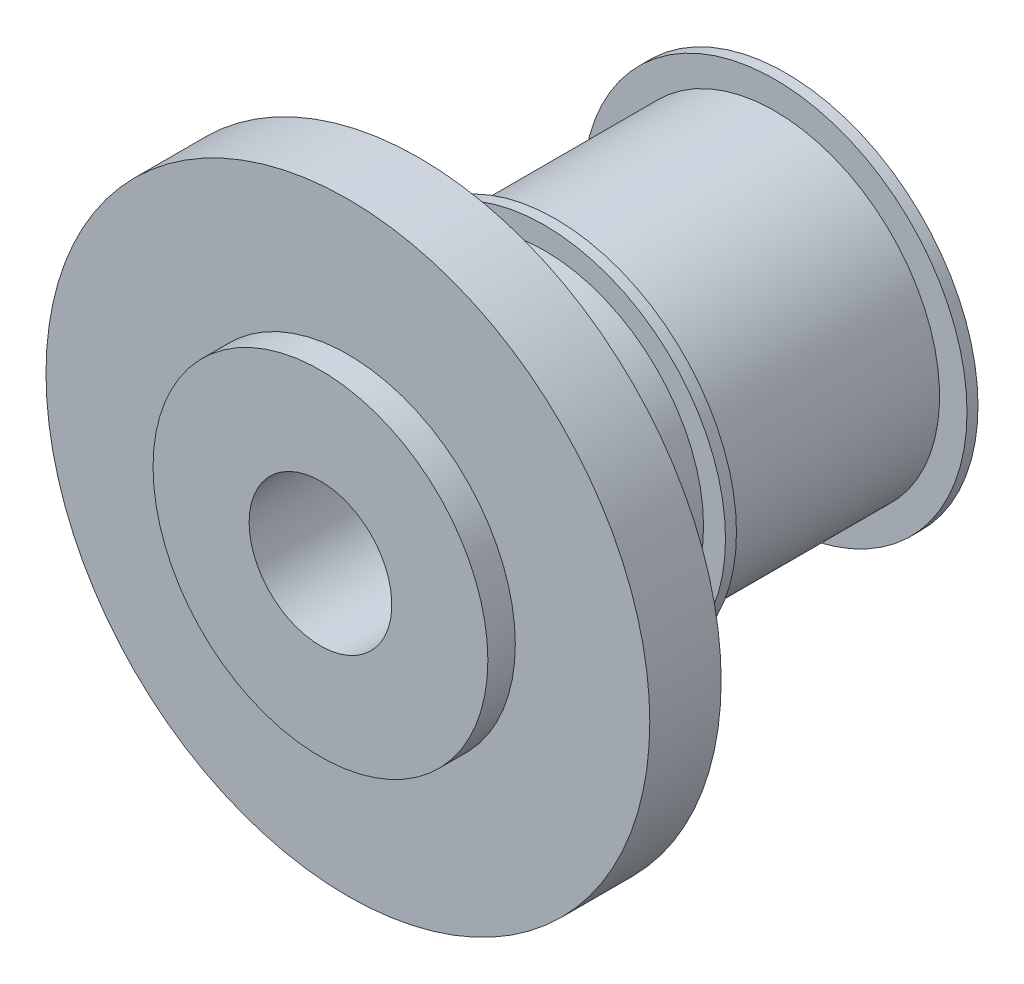
ISO-10303-21;
HEADER;
FILE_DESCRIPTION(('STEP AP214'),'2;1');
FILE_NAME('part.step','',(''),(''),'','','');
FILE_SCHEMA(('AUTOMOTIVE_DESIGN { 1 0 10303 214 1 1 1 1 }'));
ENDSEC;
DATA;
#1=APPLICATION_CONTEXT('core data for automotive mechanical design processes');
#2=APPLICATION_PROTOCOL_DEFINITION('international standard','automotive_design',2000,#1);
#3=PRODUCT_CONTEXT('',#1,'mechanical');
#4=PRODUCT('Part','Part','',(#3));
#5=PRODUCT_RELATED_PRODUCT_CATEGORY('part','',(#4));
#6=PRODUCT_DEFINITION_FORMATION('','',#4);
#7=PRODUCT_DEFINITION_CONTEXT('part definition',#1,'design');
#8=PRODUCT_DEFINITION('design','',#6,#7);
#9=PRODUCT_DEFINITION_SHAPE('','',#8);
#10=(LENGTH_UNIT() NAMED_UNIT(*) SI_UNIT(.MILLI.,.METRE.));
#11=(NAMED_UNIT(*) PLANE_ANGLE_UNIT() SI_UNIT($,.RADIAN.));
#12=(NAMED_UNIT(*) SI_UNIT($,.STERADIAN.) SOLID_ANGLE_UNIT());
#13=UNCERTAINTY_MEASURE_WITH_UNIT(LENGTH_MEASURE(1.E-05),#10,'distance_accuracy_value','');
#14=(GEOMETRIC_REPRESENTATION_CONTEXT(3) GLOBAL_UNCERTAINTY_ASSIGNED_CONTEXT((#13)) GLOBAL_UNIT_ASSIGNED_CONTEXT((#10,
#11,#12)) REPRESENTATION_CONTEXT('',''));
#15=CARTESIAN_POINT('',(0.,0.,0.));
#16=DIRECTION('',(0.,0.,1.));
#17=DIRECTION('',(1.,0.,0.));
#18=AXIS2_PLACEMENT_3D('',#15,#16,#17);
#19=CARTESIAN_POINT('',(22.3271333719099,24.3001875587976,30.6307629176066));
#20=DIRECTION('',(0.,0.,-1.));
#21=DIRECTION('',(-1.,0.,0.));
#22=AXIS2_PLACEMENT_3D('',#19,#20,#21);
#23=PLANE('',#22);
#24=CARTESIAN_POINT('',(-3.58874033552007E-12,-9.37916467798973E-13,30.6307629176066));
#25=DIRECTION('',(0.,0.,-1.));
#26=DIRECTION('',(-1.,0.,0.));
#27=AXIS2_PLACEMENT_3D('',#24,#25,#26);
#28=CIRCLE('',#27,29.);
#29=CARTESIAN_POINT('',(-29.0000000000036,-9.37916467798973E-13,30.6307629176066));
#30=VERTEX_POINT('',#29);
#31=EDGE_CURVE('E18',#30,#30,#28,.F.);
#32=ORIENTED_EDGE('',*,*,#31,.F.);
#33=EDGE_LOOP('',(#32));
#34=FACE_BOUND('',#33,.T.);
#35=CARTESIAN_POINT('',(-3.58874033552007E-12,-9.37916467798973E-13,30.6307629176066));
#36=DIRECTION('',(0.,0.,-1.));
#37=DIRECTION('',(-1.,0.,0.));
#38=AXIS2_PLACEMENT_3D('',#35,#36,#37);
#39=CIRCLE('',#38,33.);
#40=CARTESIAN_POINT('',(-33.0000000000036,-9.37916467798973E-13,30.6307629176066));
#41=VERTEX_POINT('',#40);
#42=EDGE_CURVE('E88',#41,#41,#39,.T.);
#43=ORIENTED_EDGE('',*,*,#42,.F.);
#44=EDGE_LOOP('',(#43));
#45=FACE_BOUND('',#44,.T.);
#46=ADVANCED_FACE('F15',(#34,#45),#23,.F.);
#47=CARTESIAN_POINT('',(-3.61666252501891E-12,-9.37916411203332E-13,-472.369237082393));
#48=DIRECTION('',(0.,0.,-1.));
#49=DIRECTION('',(-1.,0.,0.));
#50=AXIS2_PLACEMENT_3D('',#47,#48,#49);
#51=CYLINDRICAL_SURFACE('',#50,29.);
#52=ORIENTED_EDGE('',*,*,#31,.T.);
#53=EDGE_LOOP('',(#52));
#54=FACE_BOUND('',#53,.T.);
#55=CARTESIAN_POINT('',(-3.58840726765328E-12,-9.3791646847407E-13,36.6307629176066));
#56=DIRECTION('',(0.,0.,-1.));
#57=DIRECTION('',(-1.,0.,0.));
#58=AXIS2_PLACEMENT_3D('',#55,#56,#57);
#59=CIRCLE('',#58,29.);
#60=CARTESIAN_POINT('',(-29.0000000000036,-9.3791646847407E-13,36.6307629176066));
#61=VERTEX_POINT('',#60);
#62=EDGE_CURVE('E86',#61,#61,#59,.T.);
#63=ORIENTED_EDGE('',*,*,#62,.T.);
#64=EDGE_LOOP('',(#63));
#65=FACE_BOUND('',#64,.T.);
#66=ADVANCED_FACE('F95',(#54,#65),#51,.T.);
#67=CARTESIAN_POINT('',(-3.61666252501891E-12,-9.37916411203332E-13,-472.369237082393));
#68=DIRECTION('',(0.,0.,-1.));
#69=DIRECTION('',(-1.,0.,0.));
#70=AXIS2_PLACEMENT_3D('',#67,#68,#69);
#71=CYLINDRICAL_SURFACE('',#70,33.);
#72=ORIENTED_EDGE('',*,*,#42,.T.);
#73=EDGE_LOOP('',(#72));
#74=FACE_BOUND('',#73,.T.);
#75=CARTESIAN_POINT('',(-3.58885135814233E-12,-9.37916467573941E-13,28.6307629176066));
#76=DIRECTION('',(0.,0.,-1.));
#77=DIRECTION('',(-1.,0.,0.));
#78=AXIS2_PLACEMENT_3D('',#75,#76,#77);
#79=CIRCLE('',#78,33.);
#80=CARTESIAN_POINT('',(-33.0000000000036,-9.37916467573941E-13,28.6307629176066));
#81=VERTEX_POINT('',#80);
#82=EDGE_CURVE('E83',#81,#81,#79,.F.);
#83=ORIENTED_EDGE('',*,*,#82,.T.);
#84=EDGE_LOOP('',(#83));
#85=FACE_BOUND('',#84,.T.);
#86=ADVANCED_FACE('F104',(#74,#85),#71,.T.);
#87=CARTESIAN_POINT('',(19.6208141753143,21.3547102789433,36.6307629176066));
#88=DIRECTION('',(0.,0.,1.));
#89=DIRECTION('',(0.,-1.,0.));
#90=AXIS2_PLACEMENT_3D('',#87,#88,#89);
#91=PLANE('',#90);
#92=CARTESIAN_POINT('',(-3.58840726765328E-12,-9.3791646847407E-13,36.6307629176066));
#93=DIRECTION('',(0.,0.,-1.));
#94=DIRECTION('',(-1.,0.,0.));
#95=AXIS2_PLACEMENT_3D('',#92,#93,#94);
#96=CIRCLE('',#95,30.5);
#97=CARTESIAN_POINT('',(-30.5000000000036,-9.3791646847407E-13,36.6307629176066));
#98=VERTEX_POINT('',#97);
#99=EDGE_CURVE('E80',#98,#98,#96,.F.);
#100=ORIENTED_EDGE('',*,*,#99,.F.);
#101=EDGE_LOOP('',(#100));
#102=FACE_BOUND('',#101,.T.);
#103=ORIENTED_EDGE('',*,*,#62,.F.);
#104=EDGE_LOOP('',(#103));
#105=FACE_BOUND('',#104,.T.);
#106=ADVANCED_FACE('F188',(#102,#105),#91,.F.);
#107=CARTESIAN_POINT('',(20.2973939744632,22.0910795989068,28.6307629176066));
#108=DIRECTION('',(0.,0.,1.));
#109=DIRECTION('',(0.,-1.,0.));
#110=AXIS2_PLACEMENT_3D('',#107,#108,#109);
#111=PLANE('',#110);
#112=ORIENTED_EDGE('',*,*,#82,.F.);
#113=EDGE_LOOP('',(#112));
#114=FACE_BOUND('',#113,.T.);
#115=CARTESIAN_POINT('',(-3.58885135814233E-12,-9.37916467573941E-13,28.6307629176066));
#116=DIRECTION('',(0.,0.,-1.));
#117=DIRECTION('',(-1.,0.,0.));
#118=AXIS2_PLACEMENT_3D('',#115,#116,#117);
#119=CIRCLE('',#118,30.);
#120=CARTESIAN_POINT('',(-30.0000000000036,-9.37916467573941E-13,28.6307629176066));
#121=VERTEX_POINT('',#120);
#122=EDGE_CURVE('E77',#121,#121,#119,.T.);
#123=ORIENTED_EDGE('',*,*,#122,.F.);
#124=EDGE_LOOP('',(#123));
#125=FACE_BOUND('',#124,.T.);
#126=ADVANCED_FACE('F184',(#114,#125),#111,.F.);
#127=CARTESIAN_POINT('',(-3.61666252501891E-12,-9.37916411203332E-13,-472.369237082393));
#128=DIRECTION('',(0.,0.,-1.));
#129=DIRECTION('',(-1.,0.,0.));
#130=AXIS2_PLACEMENT_3D('',#127,#128,#129);
#131=CYLINDRICAL_SURFACE('',#130,30.5);
#132=ORIENTED_EDGE('',*,*,#99,.T.);
#133=EDGE_LOOP('',(#132));
#134=FACE_BOUND('',#133,.T.);
#135=CARTESIAN_POINT('',(-3.58829624503102E-12,-9.37916468699103E-13,38.6307629176066));
#136=DIRECTION('',(0.,0.,-1.));
#137=DIRECTION('',(-1.,0.,0.));
#138=AXIS2_PLACEMENT_3D('',#135,#136,#137);
#139=CIRCLE('',#138,30.5);
#140=CARTESIAN_POINT('',(-30.5000000000036,-9.37916468699103E-13,38.6307629176066));
#141=VERTEX_POINT('',#140);
#142=EDGE_CURVE('E74',#141,#141,#139,.T.);
#143=ORIENTED_EDGE('',*,*,#142,.T.);
#144=EDGE_LOOP('',(#143));
#145=FACE_BOUND('',#144,.T.);
#146=ADVANCED_FACE('F180',(#134,#145),#131,.T.);
#147=CARTESIAN_POINT('',(-3.61666252501891E-12,-9.37916411203332E-13,-472.369237082393));
#148=DIRECTION('',(0.,0.,-1.));
#149=DIRECTION('',(-1.,0.,0.));
#150=AXIS2_PLACEMENT_3D('',#147,#148,#149);
#151=CYLINDRICAL_SURFACE('',#150,30.);
#152=ORIENTED_EDGE('',*,*,#122,.T.);
#153=EDGE_LOOP('',(#152));
#154=FACE_BOUND('',#153,.T.);
#155=CARTESIAN_POINT('',(-3.59107181058756E-12,-9.37916463073294E-13,-11.3692370823933));
#156=DIRECTION('',(0.,0.,-1.));
#157=DIRECTION('',(-1.,0.,0.));
#158=AXIS2_PLACEMENT_3D('',#155,#156,#157);
#159=CIRCLE('',#158,30.);
#160=CARTESIAN_POINT('',(-30.0000000000036,-9.37916463073294E-13,-11.3692370823933));
#161=VERTEX_POINT('',#160);
#162=EDGE_CURVE('E71',#161,#161,#159,.F.);
#163=ORIENTED_EDGE('',*,*,#162,.T.);
#164=EDGE_LOOP('',(#163));
#165=FACE_BOUND('',#164,.T.);
#166=ADVANCED_FACE('F176',(#154,#165),#151,.T.);
#167=CARTESIAN_POINT('',(20.6356838740376,22.4592642588887,38.6307629176066));
#168=DIRECTION('',(0.,0.,-1.));
#169=DIRECTION('',(-1.,0.,0.));
#170=AXIS2_PLACEMENT_3D('',#167,#168,#169);
#171=PLANE('',#170);
#172=CARTESIAN_POINT('',(-3.58829624503102E-12,-9.37916468699103E-13,38.6307629176066));
#173=DIRECTION('',(0.,0.,-1.));
#174=DIRECTION('',(-1.,0.,0.));
#175=AXIS2_PLACEMENT_3D('',#172,#173,#174);
#176=CIRCLE('',#175,29.);
#177=CARTESIAN_POINT('',(-29.0000000000036,-9.37916468699103E-13,38.6307629176066));
#178=VERTEX_POINT('',#177);
#179=EDGE_CURVE('E68',#178,#178,#176,.F.);
#180=ORIENTED_EDGE('',*,*,#179,.F.);
#181=EDGE_LOOP('',(#180));
#182=FACE_BOUND('',#181,.T.);
#183=ORIENTED_EDGE('',*,*,#142,.F.);
#184=EDGE_LOOP('',(#183));
#185=FACE_BOUND('',#184,.T.);
#186=ADVANCED_FACE('F172',(#182,#185),#171,.F.);
#187=CARTESIAN_POINT('',(20.2973939744632,22.0910795989068,-11.3692370823933));
#188=DIRECTION('',(0.,0.,-1.));
#189=DIRECTION('',(-1.,0.,0.));
#190=AXIS2_PLACEMENT_3D('',#187,#188,#189);
#191=PLANE('',#190);
#192=ORIENTED_EDGE('',*,*,#162,.F.);
#193=EDGE_LOOP('',(#192));
#194=FACE_BOUND('',#193,.T.);
#195=CARTESIAN_POINT('',(-3.59107181058756E-12,-9.37916463073294E-13,-11.3692370823933));
#196=DIRECTION('',(0.,0.,-1.));
#197=DIRECTION('',(-1.,0.,0.));
#198=AXIS2_PLACEMENT_3D('',#195,#196,#197);
#199=CIRCLE('',#198,35.);
#200=CARTESIAN_POINT('',(-35.0000000000036,-9.37916463073294E-13,-11.3692370823933));
#201=VERTEX_POINT('',#200);
#202=EDGE_CURVE('E65',#201,#201,#199,.T.);
#203=ORIENTED_EDGE('',*,*,#202,.F.);
#204=EDGE_LOOP('',(#203));
#205=FACE_BOUND('',#204,.T.);
#206=ADVANCED_FACE('F168',(#194,#205),#191,.F.);
#207=CARTESIAN_POINT('',(-3.61666252501891E-12,-9.37916411203332E-13,-472.369237082393));
#208=DIRECTION('',(0.,0.,-1.));
#209=DIRECTION('',(-1.,0.,0.));
#210=AXIS2_PLACEMENT_3D('',#207,#208,#209);
#211=CYLINDRICAL_SURFACE('',#210,29.);
#212=ORIENTED_EDGE('',*,*,#179,.T.);
#213=EDGE_LOOP('',(#212));
#214=FACE_BOUND('',#213,.T.);
#215=CARTESIAN_POINT('',(-3.58818522240876E-12,-9.37916468924135E-13,40.6307629176066));
#216=DIRECTION('',(0.,0.,-1.));
#217=DIRECTION('',(-1.,0.,0.));
#218=AXIS2_PLACEMENT_3D('',#215,#216,#217);
#219=CIRCLE('',#218,29.);
#220=CARTESIAN_POINT('',(-29.0000000000036,-9.37916468924135E-13,40.6307629176066));
#221=VERTEX_POINT('',#220);
#222=EDGE_CURVE('E62',#221,#221,#219,.T.);
#223=ORIENTED_EDGE('',*,*,#222,.T.);
#224=EDGE_LOOP('',(#223));
#225=FACE_BOUND('',#224,.T.);
#226=ADVANCED_FACE('F164',(#214,#225),#211,.T.);
#227=CARTESIAN_POINT('',(-3.61666252501891E-12,-9.37916411203332E-13,-472.369237082393));
#228=DIRECTION('',(0.,0.,-1.));
#229=DIRECTION('',(-1.,0.,0.));
#230=AXIS2_PLACEMENT_3D('',#227,#228,#229);
#231=CYLINDRICAL_SURFACE('',#230,35.);
#232=ORIENTED_EDGE('',*,*,#202,.T.);
#233=EDGE_LOOP('',(#232));
#234=FACE_BOUND('',#233,.T.);
#235=CARTESIAN_POINT('',(-3.59118283320983E-12,-9.37916462848261E-13,-13.3692370823933));
#236=DIRECTION('',(0.,0.,-1.));
#237=DIRECTION('',(-1.,0.,0.));
#238=AXIS2_PLACEMENT_3D('',#235,#236,#237);
#239=CIRCLE('',#238,35.);
#240=CARTESIAN_POINT('',(-35.0000000000036,-9.37916462848261E-13,-13.3692370823933));
#241=VERTEX_POINT('',#240);
#242=EDGE_CURVE('E59',#241,#241,#239,.F.);
#243=ORIENTED_EDGE('',*,*,#242,.T.);
#244=EDGE_LOOP('',(#243));
#245=FACE_BOUND('',#244,.T.);
#246=ADVANCED_FACE('F160',(#234,#245),#231,.T.);
#247=CARTESIAN_POINT('',(19.6208141753143,21.3547102789433,40.6307629176066));
#248=DIRECTION('',(0.,0.,1.));
#249=DIRECTION('',(0.,-1.,0.));
#250=AXIS2_PLACEMENT_3D('',#247,#248,#249);
#251=PLANE('',#250);
#252=CARTESIAN_POINT('',(-3.58818522240876E-12,-9.37916468924135E-13,40.6307629176066));
#253=DIRECTION('',(0.,0.,-1.));
#254=DIRECTION('',(-1.,0.,0.));
#255=AXIS2_PLACEMENT_3D('',#252,#253,#254);
#256=CIRCLE('',#255,30.5);
#257=CARTESIAN_POINT('',(-30.5000000000036,-9.37916468924135E-13,40.6307629176066));
#258=VERTEX_POINT('',#257);
#259=EDGE_CURVE('E56',#258,#258,#256,.F.);
#260=ORIENTED_EDGE('',*,*,#259,.F.);
#261=EDGE_LOOP('',(#260));
#262=FACE_BOUND('',#261,.T.);
#263=ORIENTED_EDGE('',*,*,#222,.F.);
#264=EDGE_LOOP('',(#263));
#265=FACE_BOUND('',#264,.T.);
#266=ADVANCED_FACE('F156',(#262,#265),#251,.F.);
#267=CARTESIAN_POINT('',(23.6802929702077,25.7729261987248,-13.3692370823933));
#268=DIRECTION('',(0.,0.,1.));
#269=DIRECTION('',(0.,-1.,0.));
#270=AXIS2_PLACEMENT_3D('',#267,#268,#269);
#271=PLANE('',#270);
#272=ORIENTED_EDGE('',*,*,#242,.F.);
#273=EDGE_LOOP('',(#272));
#274=FACE_BOUND('',#273,.T.);
#275=CARTESIAN_POINT('',(-3.59118283320983E-12,-9.37916462848261E-13,-13.3692370823933));
#276=DIRECTION('',(0.,0.,-1.));
#277=DIRECTION('',(-1.,0.,0.));
#278=AXIS2_PLACEMENT_3D('',#275,#276,#277);
#279=CIRCLE('',#278,12.9999999999999);
#280=CARTESIAN_POINT('',(-13.0000000000035,-9.37916462848261E-13,-13.3692370823933));
#281=VERTEX_POINT('',#280);
#282=EDGE_CURVE('E53',#281,#281,#279,.F.);
#283=ORIENTED_EDGE('',*,*,#282,.T.);
#284=EDGE_LOOP('',(#283));
#285=FACE_BOUND('',#284,.T.);
#286=ADVANCED_FACE('F152',(#274,#285),#271,.F.);
#287=CARTESIAN_POINT('',(-3.61666252501891E-12,-9.37916411203332E-13,-472.369237082393));
#288=DIRECTION('',(0.,0.,-1.));
#289=DIRECTION('',(-1.,0.,0.));
#290=AXIS2_PLACEMENT_3D('',#287,#288,#289);
#291=CYLINDRICAL_SURFACE('',#290,30.5);
#292=ORIENTED_EDGE('',*,*,#259,.T.);
#293=EDGE_LOOP('',(#292));
#294=FACE_BOUND('',#293,.T.);
#295=CARTESIAN_POINT('',(-3.5880741997865E-12,-9.37916469149167E-13,42.6307629176066));
#296=DIRECTION('',(0.,0.,-1.));
#297=DIRECTION('',(-1.,0.,0.));
#298=AXIS2_PLACEMENT_3D('',#295,#296,#297);
#299=CIRCLE('',#298,30.5);
#300=CARTESIAN_POINT('',(-30.5000000000036,-9.37916469149167E-13,42.6307629176066));
#301=VERTEX_POINT('',#300);
#302=EDGE_CURVE('E50',#301,#301,#299,.T.);
#303=ORIENTED_EDGE('',*,*,#302,.T.);
#304=EDGE_LOOP('',(#303));
#305=FACE_BOUND('',#304,.T.);
#306=ADVANCED_FACE('F148',(#294,#305),#291,.T.);
#307=CARTESIAN_POINT('',(-3.61666252501891E-12,-9.37916411203332E-13,-472.369237082393));
#308=DIRECTION('',(0.,0.,-1.));
#309=DIRECTION('',(-1.,0.,0.));
#310=AXIS2_PLACEMENT_3D('',#307,#308,#309);
#311=CYLINDRICAL_SURFACE('',#310,12.9999999999999);
#312=ORIENTED_EDGE('',*,*,#282,.F.);
#313=EDGE_LOOP('',(#312));
#314=FACE_BOUND('',#313,.T.);
#315=CARTESIAN_POINT('',(-3.58647585451702E-12,-9.37916472388863E-13,71.4239086191774));
#316=DIRECTION('',(0.,0.,-1.));
#317=DIRECTION('',(-1.,0.,0.));
#318=AXIS2_PLACEMENT_3D('',#315,#316,#317);
#319=CIRCLE('',#318,12.9999999999999);
#320=CARTESIAN_POINT('',(-13.0000000000035,-9.37916472388863E-13,71.4239086191774));
#321=VERTEX_POINT('',#320);
#322=EDGE_CURVE('E47',#321,#321,#319,.F.);
#323=ORIENTED_EDGE('',*,*,#322,.T.);
#324=EDGE_LOOP('',(#323));
#325=FACE_BOUND('',#324,.T.);
#326=ADVANCED_FACE('F144',(#314,#325),#311,.F.);
#327=CARTESIAN_POINT('',(20.6356838740376,22.4592642588887,42.6307629176066));
#328=DIRECTION('',(0.,0.,-1.));
#329=DIRECTION('',(-1.,0.,0.));
#330=AXIS2_PLACEMENT_3D('',#327,#328,#329);
#331=PLANE('',#330);
#332=CARTESIAN_POINT('',(-3.5880741997865E-12,-9.37916469149167E-13,42.6307629176066));
#333=DIRECTION('',(0.,0.,-1.));
#334=DIRECTION('',(-1.,0.,0.));
#335=AXIS2_PLACEMENT_3D('',#332,#333,#334);
#336=CIRCLE('',#335,29.);
#337=CARTESIAN_POINT('',(-29.0000000000036,-9.37916469149167E-13,42.6307629176066));
#338=VERTEX_POINT('',#337);
#339=EDGE_CURVE('E44',#338,#338,#336,.F.);
#340=ORIENTED_EDGE('',*,*,#339,.F.);
#341=EDGE_LOOP('',(#340));
#342=FACE_BOUND('',#341,.T.);
#343=ORIENTED_EDGE('',*,*,#302,.F.);
#344=EDGE_LOOP('',(#343));
#345=FACE_BOUND('',#344,.T.);
#346=ADVANCED_FACE('F140',(#342,#345),#331,.F.);
#347=CARTESIAN_POINT('',(20.6356838740376,22.4592642588886,71.4239086191774));
#348=DIRECTION('',(0.,0.,-1.));
#349=DIRECTION('',(-1.,0.,0.));
#350=AXIS2_PLACEMENT_3D('',#347,#348,#349);
#351=PLANE('',#350);
#352=ORIENTED_EDGE('',*,*,#322,.F.);
#353=EDGE_LOOP('',(#352));
#354=FACE_BOUND('',#353,.T.);
#355=CARTESIAN_POINT('',(-3.58647585451702E-12,-9.37916472388863E-13,71.4239086191774));
#356=DIRECTION('',(0.,0.,-1.));
#357=DIRECTION('',(-1.,0.,0.));
#358=AXIS2_PLACEMENT_3D('',#355,#356,#357);
#359=CIRCLE('',#358,30.5);
#360=CARTESIAN_POINT('',(-30.5000000000036,-9.37916472388863E-13,71.4239086191774));
#361=VERTEX_POINT('',#360);
#362=EDGE_CURVE('E41',#361,#361,#359,.T.);
#363=ORIENTED_EDGE('',*,*,#362,.F.);
#364=EDGE_LOOP('',(#363));
#365=FACE_BOUND('',#364,.T.);
#366=ADVANCED_FACE('F136',(#354,#365),#351,.F.);
#367=CARTESIAN_POINT('',(-3.61666252501891E-12,-9.37916411203332E-13,-472.369237082393));
#368=DIRECTION('',(0.,0.,-1.));
#369=DIRECTION('',(-1.,0.,0.));
#370=AXIS2_PLACEMENT_3D('',#367,#368,#369);
#371=CYLINDRICAL_SURFACE('',#370,29.);
#372=ORIENTED_EDGE('',*,*,#339,.T.);
#373=EDGE_LOOP('',(#372));
#374=FACE_BOUND('',#373,.T.);
#375=CARTESIAN_POINT('',(-3.58796317716423E-12,-9.379164693742E-13,44.6307629176066));
#376=DIRECTION('',(0.,0.,-1.));
#377=DIRECTION('',(-1.,0.,0.));
#378=AXIS2_PLACEMENT_3D('',#375,#376,#377);
#379=CIRCLE('',#378,29.);
#380=CARTESIAN_POINT('',(-29.0000000000036,-9.379164693742E-13,44.6307629176066));
#381=VERTEX_POINT('',#380);
#382=EDGE_CURVE('E38',#381,#381,#379,.T.);
#383=ORIENTED_EDGE('',*,*,#382,.T.);
#384=EDGE_LOOP('',(#383));
#385=FACE_BOUND('',#384,.T.);
#386=ADVANCED_FACE('F132',(#374,#385),#371,.T.);
#387=CARTESIAN_POINT('',(-3.61666252501891E-12,-9.37916411203332E-13,-472.369237082393));
#388=DIRECTION('',(0.,0.,-1.));
#389=DIRECTION('',(-1.,0.,0.));
#390=AXIS2_PLACEMENT_3D('',#387,#388,#389);
#391=CYLINDRICAL_SURFACE('',#390,30.5);
#392=ORIENTED_EDGE('',*,*,#362,.T.);
#393=EDGE_LOOP('',(#392));
#394=FACE_BOUND('',#393,.T.);
#395=CARTESIAN_POINT('',(-3.58675341107267E-12,-9.37916471826281E-13,66.4239086191775));
#396=DIRECTION('',(0.,0.,-1.));
#397=DIRECTION('',(-1.,0.,0.));
#398=AXIS2_PLACEMENT_3D('',#395,#396,#397);
#399=CIRCLE('',#398,30.5);
#400=CARTESIAN_POINT('',(-30.5000000000036,-9.37916471826281E-13,66.4239086191775));
#401=VERTEX_POINT('',#400);
#402=EDGE_CURVE('E35',#401,#401,#399,.F.);
#403=ORIENTED_EDGE('',*,*,#402,.T.);
#404=EDGE_LOOP('',(#403));
#405=FACE_BOUND('',#404,.T.);
#406=ADVANCED_FACE('F128',(#394,#405),#391,.T.);
#407=CARTESIAN_POINT('',(19.6208141753143,21.3547102789433,44.6307629176065));
#408=DIRECTION('',(0.,0.,1.));
#409=DIRECTION('',(0.,-1.,0.));
#410=AXIS2_PLACEMENT_3D('',#407,#408,#409);
#411=PLANE('',#410);
#412=CARTESIAN_POINT('',(-3.58796317716423E-12,-9.379164693742E-13,44.6307629176065));
#413=DIRECTION('',(0.,0.,-1.));
#414=DIRECTION('',(-1.,0.,0.));
#415=AXIS2_PLACEMENT_3D('',#412,#413,#414);
#416=CIRCLE('',#415,30.5);
#417=CARTESIAN_POINT('',(-30.5000000000036,-9.379164693742E-13,44.6307629176065));
#418=VERTEX_POINT('',#417);
#419=EDGE_CURVE('E32',#418,#418,#416,.F.);
#420=ORIENTED_EDGE('',*,*,#419,.F.);
#421=EDGE_LOOP('',(#420));
#422=FACE_BOUND('',#421,.T.);
#423=ORIENTED_EDGE('',*,*,#382,.F.);
#424=EDGE_LOOP('',(#423));
#425=FACE_BOUND('',#424,.T.);
#426=ADVANCED_FACE('F124',(#422,#425),#411,.F.);
#427=CARTESIAN_POINT('',(37.2118889531855,40.5003125979967,66.4239086191775));
#428=DIRECTION('',(0.,0.,-1.));
#429=DIRECTION('',(-1.,0.,0.));
#430=AXIS2_PLACEMENT_3D('',#427,#428,#429);
#431=PLANE('',#430);
#432=ORIENTED_EDGE('',*,*,#402,.F.);
#433=EDGE_LOOP('',(#432));
#434=FACE_BOUND('',#433,.T.);
#435=CARTESIAN_POINT('',(-3.58675341107267E-12,-9.37916471826281E-13,66.4239086191774));
#436=DIRECTION('',(0.,0.,-1.));
#437=DIRECTION('',(-1.,0.,0.));
#438=AXIS2_PLACEMENT_3D('',#435,#436,#437);
#439=CIRCLE('',#438,55.);
#440=CARTESIAN_POINT('',(-55.0000000000036,-9.37916471826281E-13,66.4239086191774));
#441=VERTEX_POINT('',#440);
#442=EDGE_CURVE('E27',#441,#441,#439,.T.);
#443=ORIENTED_EDGE('',*,*,#442,.F.);
#444=EDGE_LOOP('',(#443));
#445=FACE_BOUND('',#444,.T.);
#446=ADVANCED_FACE('F120',(#434,#445),#431,.F.);
#447=CARTESIAN_POINT('',(-3.61666252501891E-12,-9.37916411203332E-13,-472.369237082393));
#448=DIRECTION('',(0.,0.,-1.));
#449=DIRECTION('',(-1.,0.,0.));
#450=AXIS2_PLACEMENT_3D('',#447,#448,#449);
#451=CYLINDRICAL_SURFACE('',#450,30.5);
#452=ORIENTED_EDGE('',*,*,#419,.T.);
#453=EDGE_LOOP('',(#452));
#454=FACE_BOUND('',#453,.T.);
#455=CARTESIAN_POINT('',(-3.58747505811738E-12,-9.37916470363571E-13,53.4239086191774));
#456=DIRECTION('',(0.,0.,-1.));
#457=DIRECTION('',(-1.,0.,0.));
#458=AXIS2_PLACEMENT_3D('',#455,#456,#457);
#459=CIRCLE('',#458,30.5);
#460=CARTESIAN_POINT('',(-30.5000000000036,-9.37916470363571E-13,53.4239086191774));
#461=VERTEX_POINT('',#460);
#462=EDGE_CURVE('E22',#461,#461,#459,.T.);
#463=ORIENTED_EDGE('',*,*,#462,.T.);
#464=EDGE_LOOP('',(#463));
#465=FACE_BOUND('',#464,.T.);
#466=ADVANCED_FACE('F113',(#454,#465),#451,.T.);
#467=CARTESIAN_POINT('',(-3.61666252501891E-12,-9.37916411203332E-13,-472.369237082393));
#468=DIRECTION('',(0.,0.,-1.));
#469=DIRECTION('',(-1.,0.,0.));
#470=AXIS2_PLACEMENT_3D('',#467,#468,#469);
#471=CYLINDRICAL_SURFACE('',#470,55.);
#472=ORIENTED_EDGE('',*,*,#442,.T.);
#473=EDGE_LOOP('',(#472));
#474=FACE_BOUND('',#473,.T.);
#475=CARTESIAN_POINT('',(-3.58747505811738E-12,-9.37916470363571E-13,53.4239086191774));
#476=DIRECTION('',(0.,0.,-1.));
#477=DIRECTION('',(-1.,0.,0.));
#478=AXIS2_PLACEMENT_3D('',#475,#476,#477);
#479=CIRCLE('',#478,55.);
#480=CARTESIAN_POINT('',(-55.0000000000036,-9.37916470363571E-13,53.4239086191774));
#481=VERTEX_POINT('',#480);
#482=EDGE_CURVE('E10',#481,#481,#479,.F.);
#483=ORIENTED_EDGE('',*,*,#482,.T.);
#484=EDGE_LOOP('',(#483));
#485=FACE_BOUND('',#484,.T.);
#486=ADVANCED_FACE('F107',(#474,#485),#471,.T.);
#487=CARTESIAN_POINT('',(37.2118889531855,40.5003125979967,53.4239086191774));
#488=DIRECTION('',(0.,0.,1.));
#489=DIRECTION('',(0.,-1.,0.));
#490=AXIS2_PLACEMENT_3D('',#487,#488,#489);
#491=PLANE('',#490);
#492=ORIENTED_EDGE('',*,*,#482,.F.);
#493=EDGE_LOOP('',(#492));
#494=FACE_BOUND('',#493,.T.);
#495=ORIENTED_EDGE('',*,*,#462,.F.);
#496=EDGE_LOOP('',(#495));
#497=FACE_BOUND('',#496,.T.);
#498=ADVANCED_FACE('F105',(#494,#497),#491,.F.);
#499=CLOSED_SHELL('',(#46,#66,#86,#106,#126,#146,#166,#186,#206,#226,#246,#266,#286,#306,#326,
#346,#366,#386,#406,#426,#446,#466,#486,#498));
#500=MANIFOLD_SOLID_BREP('B1',#499);
#501=ADVANCED_BREP_SHAPE_REPRESENTATION('',(#18,#500),#14);
#502=SHAPE_DEFINITION_REPRESENTATION(#9,#501);
ENDSEC;
END-ISO-10303-21;
